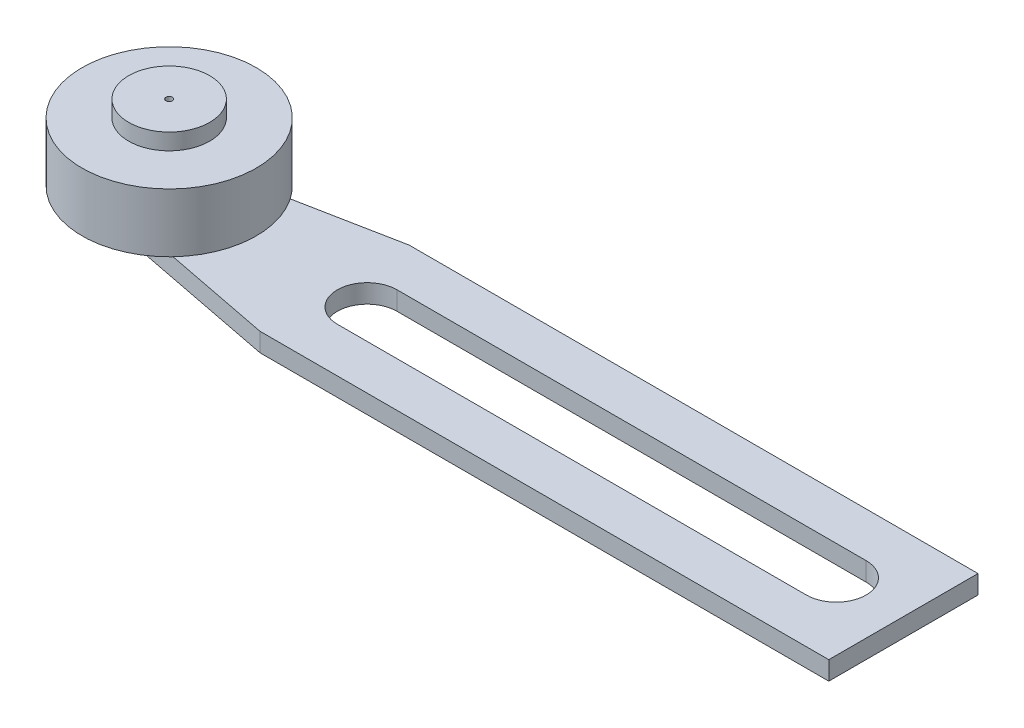
ISO-10303-21;
HEADER;
FILE_DESCRIPTION(('STEP AP214'),'2;1');
FILE_NAME('part.step','',(''),(''),'','','');
FILE_SCHEMA(('AUTOMOTIVE_DESIGN { 1 0 10303 214 1 1 1 1 }'));
ENDSEC;
DATA;
#1=APPLICATION_CONTEXT('core data for automotive mechanical design processes');
#2=APPLICATION_PROTOCOL_DEFINITION('international standard','automotive_design',2000,#1);
#3=PRODUCT_CONTEXT('',#1,'mechanical');
#4=PRODUCT('Part','Part','',(#3));
#5=PRODUCT_RELATED_PRODUCT_CATEGORY('part','',(#4));
#6=PRODUCT_DEFINITION_FORMATION('','',#4);
#7=PRODUCT_DEFINITION_CONTEXT('part definition',#1,'design');
#8=PRODUCT_DEFINITION('design','',#6,#7);
#9=PRODUCT_DEFINITION_SHAPE('','',#8);
#10=(LENGTH_UNIT() NAMED_UNIT(*) SI_UNIT(.MILLI.,.METRE.));
#11=(NAMED_UNIT(*) PLANE_ANGLE_UNIT() SI_UNIT($,.RADIAN.));
#12=(NAMED_UNIT(*) SI_UNIT($,.STERADIAN.) SOLID_ANGLE_UNIT());
#13=UNCERTAINTY_MEASURE_WITH_UNIT(LENGTH_MEASURE(1.E-05),#10,'distance_accuracy_value','');
#14=(GEOMETRIC_REPRESENTATION_CONTEXT(3) GLOBAL_UNCERTAINTY_ASSIGNED_CONTEXT((#13)) GLOBAL_UNIT_ASSIGNED_CONTEXT((#10,
#11,#12)) REPRESENTATION_CONTEXT('',''));
#15=CARTESIAN_POINT('',(0.,0.,0.));
#16=DIRECTION('',(0.,0.,1.));
#17=DIRECTION('',(1.,0.,0.));
#18=AXIS2_PLACEMENT_3D('',#15,#16,#17);
#19=CARTESIAN_POINT('',(-78.7342672307296,1.06594094550826,0.));
#20=DIRECTION('',(0.,-1.,0.));
#21=DIRECTION('',(0.,0.,-1.));
#22=AXIS2_PLACEMENT_3D('',#19,#20,#21);
#23=CYLINDRICAL_SURFACE('',#22,2.89139443202779);
#24=CARTESIAN_POINT('',(-78.7342672307296,0.,0.));
#25=DIRECTION('',(0.,-1.,0.));
#26=DIRECTION('',(0.,0.,-1.));
#27=AXIS2_PLACEMENT_3D('',#24,#25,#26);
#28=CIRCLE('',#27,2.89139443202779);
#29=CARTESIAN_POINT('',(-78.7342672307296,0.,-2.89139443202779));
#30=VERTEX_POINT('',#29);
#31=EDGE_CURVE('E11',#30,#30,#28,.T.);
#32=ORIENTED_EDGE('',*,*,#31,.T.);
#33=EDGE_LOOP('',(#32));
#34=FACE_BOUND('',#33,.T.);
#35=CARTESIAN_POINT('',(-78.7342672307296,-1.3,0.));
#36=DIRECTION('',(0.,-1.,0.));
#37=DIRECTION('',(0.,0.,-1.));
#38=AXIS2_PLACEMENT_3D('',#35,#36,#37);
#39=CIRCLE('',#38,2.89139443202779);
#40=CARTESIAN_POINT('',(-78.7342672307296,-1.3,-2.89139443202779));
#41=VERTEX_POINT('',#40);
#42=EDGE_CURVE('E91',#41,#41,#39,.T.);
#43=ORIENTED_EDGE('',*,*,#42,.F.);
#44=EDGE_LOOP('',(#43));
#45=FACE_BOUND('',#44,.T.);
#46=ADVANCED_FACE('F51',(#34,#45),#23,.T.);
#47=CARTESIAN_POINT('',(-76.3928727987018,0.,0.));
#48=DIRECTION('',(0.,1.,0.));
#49=DIRECTION('',(0.,0.,1.));
#50=AXIS2_PLACEMENT_3D('',#47,#48,#49);
#51=PLANE('',#50);
#52=CARTESIAN_POINT('',(-78.7342672307296,0.,0.));
#53=DIRECTION('',(0.,-1.,0.));
#54=DIRECTION('',(0.,0.,-1.));
#55=AXIS2_PLACEMENT_3D('',#52,#53,#54);
#56=CIRCLE('',#55,2.3413944320278);
#57=CARTESIAN_POINT('',(-78.7342672307296,0.,-2.3413944320278));
#58=VERTEX_POINT('',#57);
#59=EDGE_CURVE('E57',#58,#58,#56,.T.);
#60=ORIENTED_EDGE('',*,*,#59,.T.);
#61=EDGE_LOOP('',(#60));
#62=FACE_BOUND('',#61,.T.);
#63=ORIENTED_EDGE('',*,*,#31,.F.);
#64=EDGE_LOOP('',(#63));
#65=FACE_BOUND('',#64,.T.);
#66=ADVANCED_FACE('F99',(#62,#65),#51,.T.);
#67=CARTESIAN_POINT('',(-78.7342672307296,1.06594094550826,0.));
#68=DIRECTION('',(0.,-1.,0.));
#69=DIRECTION('',(0.,0.,-1.));
#70=AXIS2_PLACEMENT_3D('',#67,#68,#69);
#71=CYLINDRICAL_SURFACE('',#70,2.3413944320278);
#72=CARTESIAN_POINT('',(-78.7342672307296,2.,0.));
#73=DIRECTION('',(0.,-1.,0.));
#74=DIRECTION('',(0.,0.,-1.));
#75=AXIS2_PLACEMENT_3D('',#72,#73,#74);
#76=CIRCLE('',#75,2.3413944320278);
#77=CARTESIAN_POINT('',(-78.7342672307296,2.,-2.3413944320278));
#78=VERTEX_POINT('',#77);
#79=EDGE_CURVE('E61',#78,#78,#76,.T.);
#80=ORIENTED_EDGE('',*,*,#79,.T.);
#81=EDGE_LOOP('',(#80));
#82=FACE_BOUND('',#81,.T.);
#83=ORIENTED_EDGE('',*,*,#59,.F.);
#84=EDGE_LOOP('',(#83));
#85=FACE_BOUND('',#84,.T.);
#86=ADVANCED_FACE('F103',(#82,#85),#71,.T.);
#87=CARTESIAN_POINT('',(-75.0093966980785,2.,0.));
#88=DIRECTION('',(0.,-1.,0.));
#89=DIRECTION('',(0.,0.,-1.));
#90=AXIS2_PLACEMENT_3D('',#87,#88,#89);
#91=PLANE('',#90);
#92=CARTESIAN_POINT('',(-78.7342672307296,2.,0.));
#93=DIRECTION('',(0.,-1.,0.));
#94=DIRECTION('',(0.,0.,-1.));
#95=AXIS2_PLACEMENT_3D('',#92,#93,#94);
#96=CIRCLE('',#95,3.72487053265108);
#97=CARTESIAN_POINT('',(-78.7342672307296,2.,-3.72487053265108));
#98=VERTEX_POINT('',#97);
#99=EDGE_CURVE('E65',#98,#98,#96,.T.);
#100=ORIENTED_EDGE('',*,*,#99,.T.);
#101=EDGE_LOOP('',(#100));
#102=FACE_BOUND('',#101,.T.);
#103=ORIENTED_EDGE('',*,*,#79,.F.);
#104=EDGE_LOOP('',(#103));
#105=FACE_BOUND('',#104,.T.);
#106=ADVANCED_FACE('F107',(#102,#105),#91,.T.);
#107=CARTESIAN_POINT('',(-78.7342672307296,1.06594094550826,0.));
#108=DIRECTION('',(0.,-1.,0.));
#109=DIRECTION('',(0.,0.,-1.));
#110=AXIS2_PLACEMENT_3D('',#107,#108,#109);
#111=CYLINDRICAL_SURFACE('',#110,3.72487053265108);
#112=CARTESIAN_POINT('',(-78.7342672307296,2.65,0.));
#113=DIRECTION('',(0.,-1.,0.));
#114=DIRECTION('',(0.,0.,-1.));
#115=AXIS2_PLACEMENT_3D('',#112,#113,#114);
#116=CIRCLE('',#115,3.72487053265108);
#117=CARTESIAN_POINT('',(-78.7342672307296,2.65,-3.72487053265108));
#118=VERTEX_POINT('',#117);
#119=EDGE_CURVE('E70',#118,#118,#116,.T.);
#120=ORIENTED_EDGE('',*,*,#119,.T.);
#121=EDGE_LOOP('',(#120));
#122=FACE_BOUND('',#121,.T.);
#123=ORIENTED_EDGE('',*,*,#99,.F.);
#124=EDGE_LOOP('',(#123));
#125=FACE_BOUND('',#124,.T.);
#126=ADVANCED_FACE('F114',(#122,#125),#111,.T.);
#127=CARTESIAN_POINT('',(-69.3928727987018,2.65,0.));
#128=DIRECTION('',(0.,-1.,0.));
#129=DIRECTION('',(0.,0.,-1.));
#130=AXIS2_PLACEMENT_3D('',#127,#128,#129);
#131=PLANE('',#130);
#132=CARTESIAN_POINT('',(-78.7342672307296,2.65,0.));
#133=DIRECTION('',(0.,-1.,0.));
#134=DIRECTION('',(0.,0.,-1.));
#135=AXIS2_PLACEMENT_3D('',#132,#133,#134);
#136=CIRCLE('',#135,9.34139443202779);
#137=CARTESIAN_POINT('',(-78.7342672307296,2.65,-9.34139443202779));
#138=VERTEX_POINT('',#137);
#139=EDGE_CURVE('E73',#138,#138,#136,.T.);
#140=ORIENTED_EDGE('',*,*,#139,.T.);
#141=EDGE_LOOP('',(#140));
#142=FACE_BOUND('',#141,.T.);
#143=ORIENTED_EDGE('',*,*,#119,.F.);
#144=EDGE_LOOP('',(#143));
#145=FACE_BOUND('',#144,.T.);
#146=ADVANCED_FACE('F118',(#142,#145),#131,.T.);
#147=CARTESIAN_POINT('',(-78.7342672307296,1.06594094550826,0.));
#148=DIRECTION('',(0.,-1.,0.));
#149=DIRECTION('',(0.,0.,-1.));
#150=AXIS2_PLACEMENT_3D('',#147,#148,#149);
#151=CYLINDRICAL_SURFACE('',#150,9.34139443202779);
#152=CARTESIAN_POINT('',(-78.7342672307296,8.95,0.));
#153=DIRECTION('',(0.,-1.,0.));
#154=DIRECTION('',(0.,0.,-1.));
#155=AXIS2_PLACEMENT_3D('',#152,#153,#154);
#156=CIRCLE('',#155,9.34139443202779);
#157=CARTESIAN_POINT('',(-78.7342672307296,8.95,-9.34139443202779));
#158=VERTEX_POINT('',#157);
#159=EDGE_CURVE('E76',#158,#158,#156,.T.);
#160=ORIENTED_EDGE('',*,*,#159,.T.);
#161=EDGE_LOOP('',(#160));
#162=FACE_BOUND('',#161,.T.);
#163=ORIENTED_EDGE('',*,*,#139,.F.);
#164=EDGE_LOOP('',(#163));
#165=FACE_BOUND('',#164,.T.);
#166=ADVANCED_FACE('F122',(#162,#165),#151,.T.);
#167=CARTESIAN_POINT('',(-74.3928727987018,8.95,0.));
#168=DIRECTION('',(0.,1.,0.));
#169=DIRECTION('',(0.,0.,1.));
#170=AXIS2_PLACEMENT_3D('',#167,#168,#169);
#171=PLANE('',#170);
#172=CARTESIAN_POINT('',(-78.7342672307296,8.95,0.));
#173=DIRECTION('',(0.,-1.,0.));
#174=DIRECTION('',(0.,0.,-1.));
#175=AXIS2_PLACEMENT_3D('',#172,#173,#174);
#176=CIRCLE('',#175,4.3413944320278);
#177=CARTESIAN_POINT('',(-78.7342672307296,8.95,-4.3413944320278));
#178=VERTEX_POINT('',#177);
#179=EDGE_CURVE('E79',#178,#178,#176,.T.);
#180=ORIENTED_EDGE('',*,*,#179,.T.);
#181=EDGE_LOOP('',(#180));
#182=FACE_BOUND('',#181,.T.);
#183=ORIENTED_EDGE('',*,*,#159,.F.);
#184=EDGE_LOOP('',(#183));
#185=FACE_BOUND('',#184,.T.);
#186=ADVANCED_FACE('F126',(#182,#185),#171,.T.);
#187=CARTESIAN_POINT('',(-78.7342672307296,1.06594094550826,0.));
#188=DIRECTION('',(0.,-1.,0.));
#189=DIRECTION('',(0.,0.,-1.));
#190=AXIS2_PLACEMENT_3D('',#187,#188,#189);
#191=CYLINDRICAL_SURFACE('',#190,4.3413944320278);
#192=CARTESIAN_POINT('',(-78.7342672307296,10.7,0.));
#193=DIRECTION('',(0.,-1.,0.));
#194=DIRECTION('',(0.,0.,-1.));
#195=AXIS2_PLACEMENT_3D('',#192,#193,#194);
#196=CIRCLE('',#195,4.3413944320278);
#197=CARTESIAN_POINT('',(-78.7342672307296,10.7,-4.3413944320278));
#198=VERTEX_POINT('',#197);
#199=EDGE_CURVE('E82',#198,#198,#196,.T.);
#200=ORIENTED_EDGE('',*,*,#199,.T.);
#201=EDGE_LOOP('',(#200));
#202=FACE_BOUND('',#201,.T.);
#203=ORIENTED_EDGE('',*,*,#179,.F.);
#204=EDGE_LOOP('',(#203));
#205=FACE_BOUND('',#204,.T.);
#206=ADVANCED_FACE('F130',(#202,#205),#191,.T.);
#207=CARTESIAN_POINT('',(-78.3928727987018,10.7,0.));
#208=DIRECTION('',(0.,1.,0.));
#209=DIRECTION('',(0.,0.,1.));
#210=AXIS2_PLACEMENT_3D('',#207,#208,#209);
#211=PLANE('',#210);
#212=CARTESIAN_POINT('',(-78.7342672307296,10.7,0.));
#213=DIRECTION('',(0.,-1.,0.));
#214=DIRECTION('',(0.,0.,-1.));
#215=AXIS2_PLACEMENT_3D('',#212,#213,#214);
#216=CIRCLE('',#215,0.341394432027797);
#217=CARTESIAN_POINT('',(-78.7342672307296,10.7,-0.341394432027797));
#218=VERTEX_POINT('',#217);
#219=EDGE_CURVE('E85',#218,#218,#216,.T.);
#220=ORIENTED_EDGE('',*,*,#219,.T.);
#221=EDGE_LOOP('',(#220));
#222=FACE_BOUND('',#221,.T.);
#223=ORIENTED_EDGE('',*,*,#199,.F.);
#224=EDGE_LOOP('',(#223));
#225=FACE_BOUND('',#224,.T.);
#226=ADVANCED_FACE('F134',(#222,#225),#211,.T.);
#227=CARTESIAN_POINT('',(-78.7342672307296,1.06594094550826,0.));
#228=DIRECTION('',(0.,-1.,0.));
#229=DIRECTION('',(0.,0.,-1.));
#230=AXIS2_PLACEMENT_3D('',#227,#228,#229);
#231=CYLINDRICAL_SURFACE('',#230,0.341394432027797);
#232=CARTESIAN_POINT('',(-78.7342672307296,-1.3,0.));
#233=DIRECTION('',(0.,-1.,0.));
#234=DIRECTION('',(0.,0.,-1.));
#235=AXIS2_PLACEMENT_3D('',#232,#233,#234);
#236=CIRCLE('',#235,0.341394432027797);
#237=CARTESIAN_POINT('',(-78.7342672307296,-1.3,-0.341394432027797));
#238=VERTEX_POINT('',#237);
#239=EDGE_CURVE('E88',#238,#238,#236,.T.);
#240=ORIENTED_EDGE('',*,*,#239,.T.);
#241=EDGE_LOOP('',(#240));
#242=FACE_BOUND('',#241,.T.);
#243=ORIENTED_EDGE('',*,*,#219,.F.);
#244=EDGE_LOOP('',(#243));
#245=FACE_BOUND('',#244,.T.);
#246=ADVANCED_FACE('F138',(#242,#245),#231,.F.);
#247=CARTESIAN_POINT('',(-75.8428727987018,-1.3,0.));
#248=DIRECTION('',(0.,-1.,0.));
#249=DIRECTION('',(0.,0.,-1.));
#250=AXIS2_PLACEMENT_3D('',#247,#248,#249);
#251=PLANE('',#250);
#252=ORIENTED_EDGE('',*,*,#42,.T.);
#253=EDGE_LOOP('',(#252));
#254=FACE_BOUND('',#253,.T.);
#255=ORIENTED_EDGE('',*,*,#239,.F.);
#256=EDGE_LOOP('',(#255));
#257=FACE_BOUND('',#256,.T.);
#258=ADVANCED_FACE('F95',(#254,#257),#251,.T.);
#259=CLOSED_SHELL('',(#46,#66,#86,#106,#126,#146,#166,#186,#206,#226,#246,#258));
#260=MANIFOLD_SOLID_BREP('B2',#259);
#261=CARTESIAN_POINT('',(-78.499579,2.,0.00215478318075536));
#262=DIRECTION('',(0.,1.,0.));
#263=DIRECTION('',(0.,0.,1.));
#264=AXIS2_PLACEMENT_3D('',#261,#262,#263);
#265=PLANE('',#264);
#266=CARTESIAN_POINT('',(-78.499579,2.,0.00215478318075536));
#267=DIRECTION('',(0.,1.,0.));
#268=DIRECTION('',(0.,0.,1.));
#269=AXIS2_PLACEMENT_3D('',#266,#267,#268);
#270=CIRCLE('',#269,4.49999978);
#271=CARTESIAN_POINT('',(-79.3620104316772,2.,-4.41442874321782));
#272=VERTEX_POINT('',#271);
#273=CARTESIAN_POINT('',(-79.3610118392859,2.,4.41893318869307));
#274=VERTEX_POINT('',#273);
#275=EDGE_CURVE('E340',#272,#274,#270,.T.);
#276=ORIENTED_EDGE('',*,*,#275,.T.);
#277=DIRECTION('',(0.981506360320826,0.,0.191429529200079));
#278=VECTOR('',#277,1.);
#279=CARTESIAN_POINT('',(-79.3610118392859,2.,4.41893318869307));
#280=LINE('',#279,#278);
#281=CARTESIAN_POINT('',(-61.,2.,8.));
#282=VERTEX_POINT('',#281);
#283=EDGE_CURVE('E343',#274,#282,#280,.T.);
#284=ORIENTED_EDGE('',*,*,#283,.T.);
#285=DIRECTION('',(1.,0.,0.));
#286=VECTOR('',#285,1.);
#287=CARTESIAN_POINT('',(-61.,2.,8.));
#288=LINE('',#287,#286);
#289=CARTESIAN_POINT('',(0.,2.,8.));
#290=VERTEX_POINT('',#289);
#291=EDGE_CURVE('E346',#282,#290,#288,.T.);
#292=ORIENTED_EDGE('',*,*,#291,.T.);
#293=DIRECTION('',(0.,0.,-1.));
#294=VECTOR('',#293,1.);
#295=CARTESIAN_POINT('',(0.,2.,-8.));
#296=LINE('',#295,#294);
#297=CARTESIAN_POINT('',(0.,2.,-8.));
#298=VERTEX_POINT('',#297);
#299=EDGE_CURVE('E348',#290,#298,#296,.T.);
#300=ORIENTED_EDGE('',*,*,#299,.T.);
#301=DIRECTION('',(-1.,0.,0.));
#302=VECTOR('',#301,1.);
#303=CARTESIAN_POINT('',(-60.9999999995719,2.,-8.00000000000001));
#304=LINE('',#303,#302);
#305=CARTESIAN_POINT('',(-60.9999999995719,2.,-8.00000000000001));
#306=VERTEX_POINT('',#305);
#307=EDGE_CURVE('E350',#298,#306,#304,.T.);
#308=ORIENTED_EDGE('',*,*,#307,.T.);
#309=DIRECTION('',(-0.981463053848988,0.,0.191651438631228));
#310=VECTOR('',#309,1.);
#311=CARTESIAN_POINT('',(-79.3620104316772,2.,-4.41442874321782));
#312=LINE('',#311,#310);
#313=EDGE_CURVE('E352',#306,#272,#312,.T.);
#314=ORIENTED_EDGE('',*,*,#313,.T.);
#315=EDGE_LOOP('',(#276,#284,#292,#300,#308,#314));
#316=FACE_BOUND('',#315,.T.);
#317=DIRECTION('',(1.,0.,0.));
#318=VECTOR('',#317,1.);
#319=CARTESIAN_POINT('',(-7.2,2.,3.1999999999165));
#320=LINE('',#319,#318);
#321=CARTESIAN_POINT('',(-57.5,2.,3.1999999999165));
#322=VERTEX_POINT('',#321);
#323=CARTESIAN_POINT('',(-7.2,2.,3.19999999991649));
#324=VERTEX_POINT('',#323);
#325=EDGE_CURVE('E312',#322,#324,#320,.T.);
#326=ORIENTED_EDGE('',*,*,#325,.F.);
#327=CARTESIAN_POINT('',(-57.5,2.,-8.35061186865715E-11));
#328=DIRECTION('',(0.,1.,0.));
#329=DIRECTION('',(0.,0.,1.));
#330=AXIS2_PLACEMENT_3D('',#327,#328,#329);
#331=CIRCLE('',#330,3.2);
#332=CARTESIAN_POINT('',(-57.5,2.,-3.20000000008351));
#333=VERTEX_POINT('',#332);
#334=EDGE_CURVE('E304',#333,#322,#331,.T.);
#335=ORIENTED_EDGE('',*,*,#334,.F.);
#336=DIRECTION('',(-1.,0.,0.));
#337=VECTOR('',#336,1.);
#338=CARTESIAN_POINT('',(-57.5,2.,-3.20000000008351));
#339=LINE('',#338,#337);
#340=CARTESIAN_POINT('',(-7.20000000000001,2.,-3.20000000008351));
#341=VERTEX_POINT('',#340);
#342=EDGE_CURVE('E326',#341,#333,#339,.T.);
#343=ORIENTED_EDGE('',*,*,#342,.F.);
#344=CARTESIAN_POINT('',(-7.2,2.,-8.35095881335235E-11));
#345=DIRECTION('',(0.,1.,0.));
#346=DIRECTION('',(0.,0.,1.));
#347=AXIS2_PLACEMENT_3D('',#344,#345,#346);
#348=CIRCLE('',#347,3.2);
#349=EDGE_CURVE('E324',#324,#341,#348,.T.);
#350=ORIENTED_EDGE('',*,*,#349,.F.);
#351=EDGE_LOOP('',(#326,#335,#343,#350));
#352=FACE_BOUND('',#351,.T.);
#353=ADVANCED_FACE('F227',(#316,#352),#265,.T.);
#354=CARTESIAN_POINT('',(-78.499579,0.,0.00215478318075536));
#355=DIRECTION('',(0.,1.,0.));
#356=DIRECTION('',(0.,0.,1.));
#357=AXIS2_PLACEMENT_3D('',#354,#355,#356);
#358=PLANE('',#357);
#359=CARTESIAN_POINT('',(-78.499579,0.,0.00215478318075536));
#360=DIRECTION('',(0.,1.,0.));
#361=DIRECTION('',(0.,0.,1.));
#362=AXIS2_PLACEMENT_3D('',#359,#360,#361);
#363=CIRCLE('',#362,4.49999978);
#364=CARTESIAN_POINT('',(-79.3620104316772,0.,-4.41442874321782));
#365=VERTEX_POINT('',#364);
#366=CARTESIAN_POINT('',(-79.3610118392859,0.,4.41893318869307));
#367=VERTEX_POINT('',#366);
#368=EDGE_CURVE('E320',#365,#367,#363,.T.);
#369=ORIENTED_EDGE('',*,*,#368,.F.);
#370=DIRECTION('',(-0.981463053848988,0.,0.191651438631228));
#371=VECTOR('',#370,1.);
#372=CARTESIAN_POINT('',(-79.3620104316772,0.,-4.41442874321782));
#373=LINE('',#372,#371);
#374=CARTESIAN_POINT('',(-60.9999999995719,0.,-8.00000000000001));
#375=VERTEX_POINT('',#374);
#376=EDGE_CURVE('E344',#375,#365,#373,.T.);
#377=ORIENTED_EDGE('',*,*,#376,.F.);
#378=DIRECTION('',(-1.,0.,0.));
#379=VECTOR('',#378,1.);
#380=CARTESIAN_POINT('',(-60.9999999995719,0.,-8.00000000000001));
#381=LINE('',#380,#379);
#382=CARTESIAN_POINT('',(0.,0.,-8.));
#383=VERTEX_POINT('',#382);
#384=EDGE_CURVE('E363',#383,#375,#381,.T.);
#385=ORIENTED_EDGE('',*,*,#384,.F.);
#386=DIRECTION('',(0.,0.,-1.));
#387=VECTOR('',#386,1.);
#388=CARTESIAN_POINT('',(0.,0.,-8.));
#389=LINE('',#388,#387);
#390=CARTESIAN_POINT('',(0.,0.,8.));
#391=VERTEX_POINT('',#390);
#392=EDGE_CURVE('E361',#391,#383,#389,.T.);
#393=ORIENTED_EDGE('',*,*,#392,.F.);
#394=DIRECTION('',(1.,0.,0.));
#395=VECTOR('',#394,1.);
#396=CARTESIAN_POINT('',(-61.,0.,8.));
#397=LINE('',#396,#395);
#398=CARTESIAN_POINT('',(-61.,0.,8.));
#399=VERTEX_POINT('',#398);
#400=EDGE_CURVE('E359',#399,#391,#397,.T.);
#401=ORIENTED_EDGE('',*,*,#400,.F.);
#402=DIRECTION('',(0.981506360320826,0.,0.191429529200079));
#403=VECTOR('',#402,1.);
#404=CARTESIAN_POINT('',(-79.3610118392859,0.,4.41893318869307));
#405=LINE('',#404,#403);
#406=EDGE_CURVE('E357',#367,#399,#405,.T.);
#407=ORIENTED_EDGE('',*,*,#406,.F.);
#408=EDGE_LOOP('',(#369,#377,#385,#393,#401,#407));
#409=FACE_BOUND('',#408,.T.);
#410=CARTESIAN_POINT('',(-57.5,0.,-8.35061186865715E-11));
#411=DIRECTION('',(0.,1.,0.));
#412=DIRECTION('',(0.,0.,1.));
#413=AXIS2_PLACEMENT_3D('',#410,#411,#412);
#414=CIRCLE('',#413,3.2);
#415=CARTESIAN_POINT('',(-57.5,0.,-3.20000000008351));
#416=VERTEX_POINT('',#415);
#417=CARTESIAN_POINT('',(-57.5,0.,3.1999999999165));
#418=VERTEX_POINT('',#417);
#419=EDGE_CURVE('E250',#416,#418,#414,.T.);
#420=ORIENTED_EDGE('',*,*,#419,.T.);
#421=DIRECTION('',(1.,0.,0.));
#422=VECTOR('',#421,1.);
#423=CARTESIAN_POINT('',(-7.2,0.,3.1999999999165));
#424=LINE('',#423,#422);
#425=CARTESIAN_POINT('',(-7.2,0.,3.19999999991649));
#426=VERTEX_POINT('',#425);
#427=EDGE_CURVE('E319',#418,#426,#424,.T.);
#428=ORIENTED_EDGE('',*,*,#427,.T.);
#429=CARTESIAN_POINT('',(-7.2,0.,-8.35095881335235E-11));
#430=DIRECTION('',(0.,1.,0.));
#431=DIRECTION('',(0.,0.,1.));
#432=AXIS2_PLACEMENT_3D('',#429,#430,#431);
#433=CIRCLE('',#432,3.2);
#434=CARTESIAN_POINT('',(-7.2,0.,-3.20000000008351));
#435=VERTEX_POINT('',#434);
#436=EDGE_CURVE('E332',#426,#435,#433,.T.);
#437=ORIENTED_EDGE('',*,*,#436,.T.);
#438=DIRECTION('',(-1.,0.,0.));
#439=VECTOR('',#438,1.);
#440=CARTESIAN_POINT('',(-57.5,0.,-3.20000000008351));
#441=LINE('',#440,#439);
#442=EDGE_CURVE('E313',#435,#416,#441,.T.);
#443=ORIENTED_EDGE('',*,*,#442,.T.);
#444=EDGE_LOOP('',(#420,#428,#437,#443));
#445=FACE_BOUND('',#444,.T.);
#446=ADVANCED_FACE('F387',(#409,#445),#358,.F.);
#447=CARTESIAN_POINT('',(-78.499579,2.,0.00215478318075536));
#448=DIRECTION('',(0.,-1.,0.));
#449=DIRECTION('',(0.,0.,-1.));
#450=AXIS2_PLACEMENT_3D('',#447,#448,#449);
#451=CYLINDRICAL_SURFACE('',#450,4.49999978);
#452=ORIENTED_EDGE('',*,*,#368,.T.);
#453=DIRECTION('',(0.,-1.,0.));
#454=VECTOR('',#453,1.);
#455=CARTESIAN_POINT('',(-79.3610118392859,2.,4.41893318869307));
#456=LINE('',#455,#454);
#457=EDGE_CURVE('E49',#274,#367,#456,.T.);
#458=ORIENTED_EDGE('',*,*,#457,.F.);
#459=ORIENTED_EDGE('',*,*,#275,.F.);
#460=DIRECTION('',(0.,-1.,0.));
#461=VECTOR('',#460,1.);
#462=CARTESIAN_POINT('',(-79.3620104316772,2.,-4.41442874321782));
#463=LINE('',#462,#461);
#464=EDGE_CURVE('E354',#272,#365,#463,.T.);
#465=ORIENTED_EDGE('',*,*,#464,.T.);
#466=EDGE_LOOP('',(#452,#458,#459,#465));
#467=FACE_BOUND('',#466,.T.);
#468=ADVANCED_FACE('F229',(#467),#451,.T.);
#469=CARTESIAN_POINT('',(-79.3610118392859,2.,4.41893318869307));
#470=DIRECTION('',(0.191429529200079,0.,-0.981506360320827));
#471=DIRECTION('',(-0.981506360320827,0.,-0.191429529200079));
#472=AXIS2_PLACEMENT_3D('',#469,#470,#471);
#473=PLANE('',#472);
#474=ORIENTED_EDGE('',*,*,#406,.T.);
#475=DIRECTION('',(0.,-1.,0.));
#476=VECTOR('',#475,1.);
#477=CARTESIAN_POINT('',(-61.,2.,8.));
#478=LINE('',#477,#476);
#479=EDGE_CURVE('E235',#282,#399,#478,.T.);
#480=ORIENTED_EDGE('',*,*,#479,.F.);
#481=ORIENTED_EDGE('',*,*,#283,.F.);
#482=ORIENTED_EDGE('',*,*,#457,.T.);
#483=EDGE_LOOP('',(#474,#480,#481,#482));
#484=FACE_BOUND('',#483,.T.);
#485=ADVANCED_FACE('F404',(#484),#473,.F.);
#486=CARTESIAN_POINT('',(-61.,2.,8.));
#487=DIRECTION('',(0.,0.,-1.));
#488=DIRECTION('',(-1.,0.,0.));
#489=AXIS2_PLACEMENT_3D('',#486,#487,#488);
#490=PLANE('',#489);
#491=ORIENTED_EDGE('',*,*,#400,.T.);
#492=DIRECTION('',(0.,-1.,0.));
#493=VECTOR('',#492,1.);
#494=CARTESIAN_POINT('',(0.,2.,8.));
#495=LINE('',#494,#493);
#496=EDGE_CURVE('E374',#290,#391,#495,.T.);
#497=ORIENTED_EDGE('',*,*,#496,.F.);
#498=ORIENTED_EDGE('',*,*,#291,.F.);
#499=ORIENTED_EDGE('',*,*,#479,.T.);
#500=EDGE_LOOP('',(#491,#497,#498,#499));
#501=FACE_BOUND('',#500,.T.);
#502=ADVANCED_FACE('F381',(#501),#490,.F.);
#503=CARTESIAN_POINT('',(0.,2.,-8.));
#504=DIRECTION('',(-1.,0.,0.));
#505=DIRECTION('',(0.,0.,1.));
#506=AXIS2_PLACEMENT_3D('',#503,#504,#505);
#507=PLANE('',#506);
#508=ORIENTED_EDGE('',*,*,#392,.T.);
#509=DIRECTION('',(0.,-1.,0.));
#510=VECTOR('',#509,1.);
#511=CARTESIAN_POINT('',(0.,2.,-8.));
#512=LINE('',#511,#510);
#513=EDGE_CURVE('E371',#298,#383,#512,.T.);
#514=ORIENTED_EDGE('',*,*,#513,.F.);
#515=ORIENTED_EDGE('',*,*,#299,.F.);
#516=ORIENTED_EDGE('',*,*,#496,.T.);
#517=EDGE_LOOP('',(#508,#514,#515,#516));
#518=FACE_BOUND('',#517,.T.);
#519=ADVANCED_FACE('F393',(#518),#507,.F.);
#520=CARTESIAN_POINT('',(-60.9999999995719,2.,-8.00000000000001));
#521=DIRECTION('',(0.,0.,1.));
#522=DIRECTION('',(1.,0.,0.));
#523=AXIS2_PLACEMENT_3D('',#520,#521,#522);
#524=PLANE('',#523);
#525=ORIENTED_EDGE('',*,*,#384,.T.);
#526=DIRECTION('',(0.,-1.,0.));
#527=VECTOR('',#526,1.);
#528=CARTESIAN_POINT('',(-60.9999999995719,2.,-8.00000000000001));
#529=LINE('',#528,#527);
#530=EDGE_CURVE('E368',#306,#375,#529,.T.);
#531=ORIENTED_EDGE('',*,*,#530,.F.);
#532=ORIENTED_EDGE('',*,*,#307,.F.);
#533=ORIENTED_EDGE('',*,*,#513,.T.);
#534=EDGE_LOOP('',(#525,#531,#532,#533));
#535=FACE_BOUND('',#534,.T.);
#536=ADVANCED_FACE('F397',(#535),#524,.F.);
#537=CARTESIAN_POINT('',(-79.3620104316772,2.,-4.41442874321782));
#538=DIRECTION('',(0.191651438631228,0.,0.981463053848987));
#539=DIRECTION('',(0.981463053848988,0.,-0.191651438631228));
#540=AXIS2_PLACEMENT_3D('',#537,#538,#539);
#541=PLANE('',#540);
#542=ORIENTED_EDGE('',*,*,#376,.T.);
#543=ORIENTED_EDGE('',*,*,#464,.F.);
#544=ORIENTED_EDGE('',*,*,#313,.F.);
#545=ORIENTED_EDGE('',*,*,#530,.T.);
#546=EDGE_LOOP('',(#542,#543,#544,#545));
#547=FACE_BOUND('',#546,.T.);
#548=ADVANCED_FACE('F407',(#547),#541,.F.);
#549=CARTESIAN_POINT('',(-57.5,2.,-8.35061186865715E-11));
#550=DIRECTION('',(0.,-1.,0.));
#551=DIRECTION('',(0.,0.,-1.));
#552=AXIS2_PLACEMENT_3D('',#549,#550,#551);
#553=CYLINDRICAL_SURFACE('',#552,3.2);
#554=ORIENTED_EDGE('',*,*,#419,.F.);
#555=DIRECTION('',(0.,-1.,0.));
#556=VECTOR('',#555,1.);
#557=CARTESIAN_POINT('',(-57.5,2.,-3.20000000008351));
#558=LINE('',#557,#556);
#559=EDGE_CURVE('E308',#333,#416,#558,.T.);
#560=ORIENTED_EDGE('',*,*,#559,.F.);
#561=ORIENTED_EDGE('',*,*,#334,.T.);
#562=DIRECTION('',(0.,-1.,0.));
#563=VECTOR('',#562,1.);
#564=CARTESIAN_POINT('',(-57.5,2.,3.1999999999165));
#565=LINE('',#564,#563);
#566=EDGE_CURVE('E307',#322,#418,#565,.T.);
#567=ORIENTED_EDGE('',*,*,#566,.T.);
#568=EDGE_LOOP('',(#554,#560,#561,#567));
#569=FACE_BOUND('',#568,.T.);
#570=ADVANCED_FACE('F306',(#569),#553,.F.);
#571=CARTESIAN_POINT('',(-7.2,2.,3.1999999999165));
#572=DIRECTION('',(0.,0.,-1.));
#573=DIRECTION('',(-1.,0.,0.));
#574=AXIS2_PLACEMENT_3D('',#571,#572,#573);
#575=PLANE('',#574);
#576=ORIENTED_EDGE('',*,*,#427,.F.);
#577=ORIENTED_EDGE('',*,*,#566,.F.);
#578=ORIENTED_EDGE('',*,*,#325,.T.);
#579=DIRECTION('',(0.,-1.,0.));
#580=VECTOR('',#579,1.);
#581=CARTESIAN_POINT('',(-7.2,2.,3.19999999991649));
#582=LINE('',#581,#580);
#583=EDGE_CURVE('E321',#324,#426,#582,.T.);
#584=ORIENTED_EDGE('',*,*,#583,.T.);
#585=EDGE_LOOP('',(#576,#577,#578,#584));
#586=FACE_BOUND('',#585,.T.);
#587=ADVANCED_FACE('F316',(#586),#575,.T.);
#588=CARTESIAN_POINT('',(-7.2,2.,-8.35095881335235E-11));
#589=DIRECTION('',(0.,-1.,0.));
#590=DIRECTION('',(0.,0.,-1.));
#591=AXIS2_PLACEMENT_3D('',#588,#589,#590);
#592=CYLINDRICAL_SURFACE('',#591,3.2);
#593=ORIENTED_EDGE('',*,*,#436,.F.);
#594=ORIENTED_EDGE('',*,*,#583,.F.);
#595=ORIENTED_EDGE('',*,*,#349,.T.);
#596=DIRECTION('',(0.,-1.,0.));
#597=VECTOR('',#596,1.);
#598=CARTESIAN_POINT('',(-7.2,2.,-3.20000000008351));
#599=LINE('',#598,#597);
#600=EDGE_CURVE('E242',#341,#435,#599,.T.);
#601=ORIENTED_EDGE('',*,*,#600,.T.);
#602=EDGE_LOOP('',(#593,#594,#595,#601));
#603=FACE_BOUND('',#602,.T.);
#604=ADVANCED_FACE('F425',(#603),#592,.F.);
#605=CARTESIAN_POINT('',(-57.5,2.,-3.20000000008351));
#606=DIRECTION('',(0.,0.,1.));
#607=DIRECTION('',(1.,0.,0.));
#608=AXIS2_PLACEMENT_3D('',#605,#606,#607);
#609=PLANE('',#608);
#610=ORIENTED_EDGE('',*,*,#442,.F.);
#611=ORIENTED_EDGE('',*,*,#600,.F.);
#612=ORIENTED_EDGE('',*,*,#342,.T.);
#613=ORIENTED_EDGE('',*,*,#559,.T.);
#614=EDGE_LOOP('',(#610,#611,#612,#613));
#615=FACE_BOUND('',#614,.T.);
#616=ADVANCED_FACE('F428',(#615),#609,.T.);
#617=CLOSED_SHELL('',(#353,#446,#468,#485,#502,#519,#536,#548,#570,#587,#604,#616));
#618=MANIFOLD_SOLID_BREP('B6',#617);
#619=ADVANCED_BREP_SHAPE_REPRESENTATION('',(#18,#260,#618),#14);
#620=SHAPE_DEFINITION_REPRESENTATION(#9,#619);
ENDSEC;
END-ISO-10303-21;
